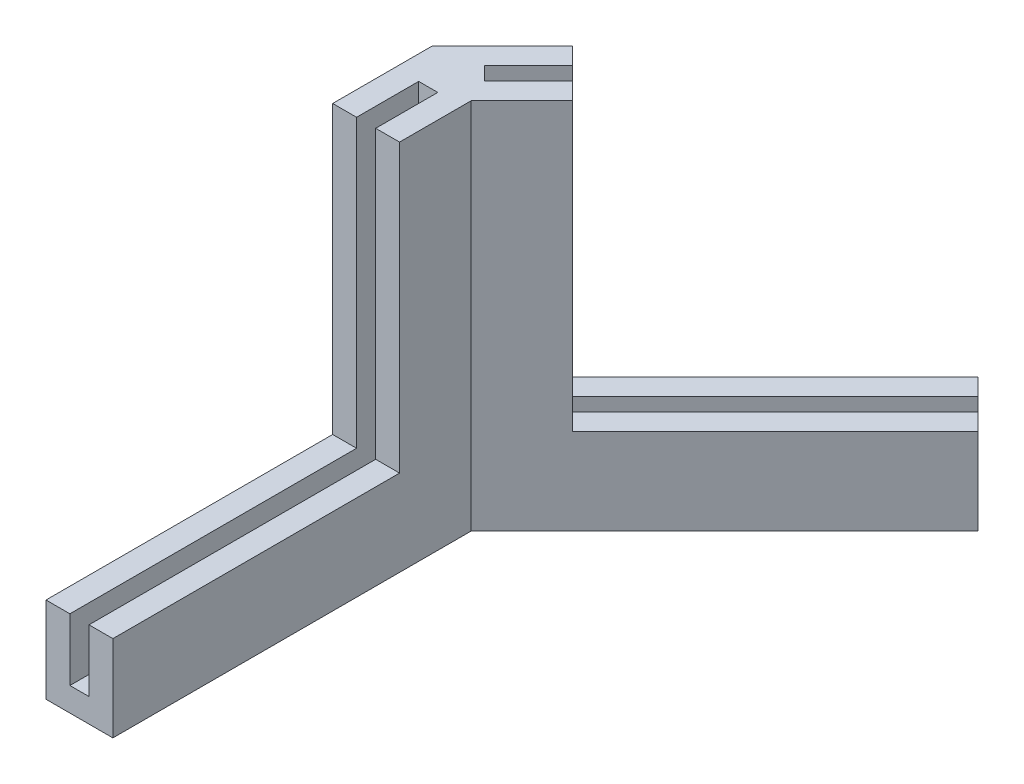
ISO-10303-21;
HEADER;
FILE_DESCRIPTION(('STEP AP214'),'2;1');
FILE_NAME('part.step','',(''),(''),'','','');
FILE_SCHEMA(('AUTOMOTIVE_DESIGN { 1 0 10303 214 1 1 1 1 }'));
ENDSEC;
DATA;
#1=APPLICATION_CONTEXT('core data for automotive mechanical design processes');
#2=APPLICATION_PROTOCOL_DEFINITION('international standard','automotive_design',2000,#1);
#3=PRODUCT_CONTEXT('',#1,'mechanical');
#4=PRODUCT('Part','Part','',(#3));
#5=PRODUCT_RELATED_PRODUCT_CATEGORY('part','',(#4));
#6=PRODUCT_DEFINITION_FORMATION('','',#4);
#7=PRODUCT_DEFINITION_CONTEXT('part definition',#1,'design');
#8=PRODUCT_DEFINITION('design','',#6,#7);
#9=PRODUCT_DEFINITION_SHAPE('','',#8);
#10=(LENGTH_UNIT() NAMED_UNIT(*) SI_UNIT(.MILLI.,.METRE.));
#11=(NAMED_UNIT(*) PLANE_ANGLE_UNIT() SI_UNIT($,.RADIAN.));
#12=(NAMED_UNIT(*) SI_UNIT($,.STERADIAN.) SOLID_ANGLE_UNIT());
#13=UNCERTAINTY_MEASURE_WITH_UNIT(LENGTH_MEASURE(1.E-05),#10,'distance_accuracy_value','');
#14=(GEOMETRIC_REPRESENTATION_CONTEXT(3) GLOBAL_UNCERTAINTY_ASSIGNED_CONTEXT((#13)) GLOBAL_UNIT_ASSIGNED_CONTEXT((#10,
#11,#12)) REPRESENTATION_CONTEXT('',''));
#15=CARTESIAN_POINT('',(0.,0.,0.));
#16=DIRECTION('',(0.,0.,1.));
#17=DIRECTION('',(1.,0.,0.));
#18=AXIS2_PLACEMENT_3D('',#15,#16,#17);
#19=CARTESIAN_POINT('',(10.6066017177981,78.,-10.6066017177983));
#20=DIRECTION('',(0.707106781186539,0.,-0.707106781186556));
#21=DIRECTION('',(-0.707106781186556,0.,-0.707106781186539));
#22=AXIS2_PLACEMENT_3D('',#19,#20,#21);
#23=PLANE('',#22);
#24=DIRECTION('',(0.,-1.,0.));
#25=VECTOR('',#24,1.);
#26=CARTESIAN_POINT('',(10.6066017177981,78.,-10.6066017177983));
#27=LINE('',#26,#25);
#28=CARTESIAN_POINT('',(10.6066017177981,78.,-10.6066017177983));
#29=VERTEX_POINT('',#28);
#30=CARTESIAN_POINT('',(10.6066017177981,18.,-10.6066017177983));
#31=VERTEX_POINT('',#30);
#32=EDGE_CURVE('E375',#29,#31,#27,.T.);
#33=ORIENTED_EDGE('',*,*,#32,.T.);
#34=DIRECTION('',(-0.707106781186556,0.,-0.707106781186539));
#35=VECTOR('',#34,1.);
#36=CARTESIAN_POINT('',(10.6066017177981,18.,-10.6066017177983));
#37=LINE('',#36,#35);
#38=CARTESIAN_POINT('',(7.07106781186529,18.,-14.142135623731));
#39=VERTEX_POINT('',#38);
#40=EDGE_CURVE('E211',#31,#39,#37,.T.);
#41=ORIENTED_EDGE('',*,*,#40,.T.);
#42=DIRECTION('',(0.,-1.,0.));
#43=VECTOR('',#42,1.);
#44=CARTESIAN_POINT('',(7.07106781186529,78.,-14.142135623731));
#45=LINE('',#44,#43);
#46=CARTESIAN_POINT('',(7.07106781186529,78.,-14.142135623731));
#47=VERTEX_POINT('',#46);
#48=EDGE_CURVE('E371',#47,#39,#45,.T.);
#49=ORIENTED_EDGE('',*,*,#48,.F.);
#50=DIRECTION('',(0.707106781186556,0.,0.707106781186539));
#51=VECTOR('',#50,1.);
#52=CARTESIAN_POINT('',(10.6066017177981,78.,-10.6066017177983));
#53=LINE('',#52,#51);
#54=EDGE_CURVE('E328',#47,#29,#53,.T.);
#55=ORIENTED_EDGE('',*,*,#54,.T.);
#56=EDGE_LOOP('',(#33,#41,#49,#55));
#57=FACE_BOUND('',#56,.T.);
#58=ADVANCED_FACE('F39',(#57),#23,.T.);
#59=DIRECTION('',(0.,-1.,0.));
#60=VECTOR('',#59,1.);
#61=CARTESIAN_POINT('',(4.24264068711906,78.,-16.9705627484772));
#62=LINE('',#61,#60);
#63=CARTESIAN_POINT('',(4.24264068711906,78.,-16.9705627484772));
#64=VERTEX_POINT('',#63);
#65=CARTESIAN_POINT('',(4.24264068711907,18.,-16.9705627484772));
#66=VERTEX_POINT('',#65);
#67=EDGE_CURVE('E359',#64,#66,#62,.T.);
#68=ORIENTED_EDGE('',*,*,#67,.T.);
#69=DIRECTION('',(-0.707106781186556,0.,-0.707106781186539));
#70=VECTOR('',#69,1.);
#71=CARTESIAN_POINT('',(0.707106781186285,18.,-20.5060966544099));
#72=LINE('',#71,#70);
#73=CARTESIAN_POINT('',(0.707106781186281,18.,-20.5060966544099));
#74=VERTEX_POINT('',#73);
#75=EDGE_CURVE('E239',#66,#74,#72,.T.);
#76=ORIENTED_EDGE('',*,*,#75,.T.);
#77=DIRECTION('',(0.,-1.,0.));
#78=VECTOR('',#77,1.);
#79=CARTESIAN_POINT('',(0.707106781186281,78.,-20.5060966544099));
#80=LINE('',#79,#78);
#81=CARTESIAN_POINT('',(0.707106781186281,78.,-20.5060966544099));
#82=VERTEX_POINT('',#81);
#83=EDGE_CURVE('E196',#82,#74,#80,.T.);
#84=ORIENTED_EDGE('',*,*,#83,.F.);
#85=DIRECTION('',(0.707106781186556,0.,0.707106781186539));
#86=VECTOR('',#85,1.);
#87=CARTESIAN_POINT('',(4.24264068711906,78.,-16.9705627484772));
#88=LINE('',#87,#86);
#89=EDGE_CURVE('E345',#82,#64,#88,.T.);
#90=ORIENTED_EDGE('',*,*,#89,.T.);
#91=EDGE_LOOP('',(#68,#76,#84,#90));
#92=FACE_BOUND('',#91,.T.);
#93=ADVANCED_FACE('F473',(#92),#23,.T.);
#94=CARTESIAN_POINT('',(0.,78.,15.));
#95=DIRECTION('',(0.,0.,-1.));
#96=DIRECTION('',(-1.,0.,0.));
#97=AXIS2_PLACEMENT_3D('',#94,#95,#96);
#98=PLANE('',#97);
#99=DIRECTION('',(-1.,0.,0.));
#100=VECTOR('',#99,1.);
#101=CARTESIAN_POINT('',(-14.,18.,15.));
#102=LINE('',#101,#100);
#103=CARTESIAN_POINT('',(-9.,18.,15.));
#104=VERTEX_POINT('',#103);
#105=CARTESIAN_POINT('',(-14.,18.,15.));
#106=VERTEX_POINT('',#105);
#107=EDGE_CURVE('E257',#104,#106,#102,.T.);
#108=ORIENTED_EDGE('',*,*,#107,.F.);
#109=DIRECTION('',(0.,-1.,0.));
#110=VECTOR('',#109,1.);
#111=CARTESIAN_POINT('',(-9.,78.,15.));
#112=LINE('',#111,#110);
#113=CARTESIAN_POINT('',(-9.,78.,15.));
#114=VERTEX_POINT('',#113);
#115=EDGE_CURVE('E425',#114,#104,#112,.T.);
#116=ORIENTED_EDGE('',*,*,#115,.F.);
#117=DIRECTION('',(1.,0.,0.));
#118=VECTOR('',#117,1.);
#119=CARTESIAN_POINT('',(-9.,78.,15.));
#120=LINE('',#119,#118);
#121=CARTESIAN_POINT('',(-14.,78.,15.));
#122=VERTEX_POINT('',#121);
#123=EDGE_CURVE('E383',#122,#114,#120,.T.);
#124=ORIENTED_EDGE('',*,*,#123,.F.);
#125=DIRECTION('',(0.,-1.,0.));
#126=VECTOR('',#125,1.);
#127=CARTESIAN_POINT('',(-14.,78.,15.));
#128=LINE('',#127,#126);
#129=EDGE_CURVE('E48',#122,#106,#128,.T.);
#130=ORIENTED_EDGE('',*,*,#129,.T.);
#131=EDGE_LOOP('',(#108,#116,#124,#130));
#132=FACE_BOUND('',#131,.T.);
#133=ADVANCED_FACE('F471',(#132),#98,.F.);
#134=DIRECTION('',(-1.,0.,0.));
#135=VECTOR('',#134,1.);
#136=CARTESIAN_POINT('',(0.,18.,15.));
#137=LINE('',#136,#135);
#138=CARTESIAN_POINT('',(0.,18.,15.));
#139=VERTEX_POINT('',#138);
#140=CARTESIAN_POINT('',(-5.,18.,15.));
#141=VERTEX_POINT('',#140);
#142=EDGE_CURVE('E198',#139,#141,#137,.T.);
#143=ORIENTED_EDGE('',*,*,#142,.F.);
#144=DIRECTION('',(0.,-1.,0.));
#145=VECTOR('',#144,1.);
#146=CARTESIAN_POINT('',(0.,78.,15.));
#147=LINE('',#146,#145);
#148=CARTESIAN_POINT('',(0.,78.,15.));
#149=VERTEX_POINT('',#148);
#150=EDGE_CURVE('E410',#149,#139,#147,.T.);
#151=ORIENTED_EDGE('',*,*,#150,.F.);
#152=DIRECTION('',(1.,0.,0.));
#153=VECTOR('',#152,1.);
#154=CARTESIAN_POINT('',(0.,78.,15.));
#155=LINE('',#154,#153);
#156=CARTESIAN_POINT('',(-5.,78.,15.));
#157=VERTEX_POINT('',#156);
#158=EDGE_CURVE('E396',#157,#149,#155,.T.);
#159=ORIENTED_EDGE('',*,*,#158,.F.);
#160=DIRECTION('',(0.,-1.,0.));
#161=VECTOR('',#160,1.);
#162=CARTESIAN_POINT('',(-5.,78.,15.));
#163=LINE('',#162,#161);
#164=EDGE_CURVE('E414',#157,#141,#163,.T.);
#165=ORIENTED_EDGE('',*,*,#164,.T.);
#166=EDGE_LOOP('',(#143,#151,#159,#165));
#167=FACE_BOUND('',#166,.T.);
#168=ADVANCED_FACE('F464',(#167),#98,.F.);
#169=CARTESIAN_POINT('',(-9.00000000000004,78.,1.99999999999999));
#170=DIRECTION('',(-1.,0.,0.));
#171=DIRECTION('',(0.,0.,1.));
#172=AXIS2_PLACEMENT_3D('',#169,#170,#171);
#173=PLANE('',#172);
#174=DIRECTION('',(0.,0.,-1.));
#175=VECTOR('',#174,1.);
#176=CARTESIAN_POINT('',(-9.00000000000004,5.,15.));
#177=LINE('',#176,#175);
#178=CARTESIAN_POINT('',(-9.,5.,75.));
#179=VERTEX_POINT('',#178);
#180=CARTESIAN_POINT('',(-9.00000000000004,4.99999999999999,1.99999999999999));
#181=VERTEX_POINT('',#180);
#182=EDGE_CURVE('E306',#179,#181,#177,.T.);
#183=ORIENTED_EDGE('',*,*,#182,.T.);
#184=DIRECTION('',(0.,-1.,0.));
#185=VECTOR('',#184,1.);
#186=CARTESIAN_POINT('',(-9.00000000000004,78.,1.99999999999999));
#187=LINE('',#186,#185);
#188=CARTESIAN_POINT('',(-9.00000000000004,78.,1.99999999999999));
#189=VERTEX_POINT('',#188);
#190=EDGE_CURVE('E421',#189,#181,#187,.T.);
#191=ORIENTED_EDGE('',*,*,#190,.F.);
#192=DIRECTION('',(0.,0.,-1.));
#193=VECTOR('',#192,1.);
#194=CARTESIAN_POINT('',(-9.00000000000004,78.,1.99999999999999));
#195=LINE('',#194,#193);
#196=EDGE_CURVE('E387',#114,#189,#195,.T.);
#197=ORIENTED_EDGE('',*,*,#196,.F.);
#198=ORIENTED_EDGE('',*,*,#115,.T.);
#199=DIRECTION('',(0.,0.,-1.));
#200=VECTOR('',#199,1.);
#201=CARTESIAN_POINT('',(-9.,18.,75.));
#202=LINE('',#201,#200);
#203=CARTESIAN_POINT('',(-9.,18.,75.));
#204=VERTEX_POINT('',#203);
#205=EDGE_CURVE('E290',#204,#104,#202,.T.);
#206=ORIENTED_EDGE('',*,*,#205,.F.);
#207=DIRECTION('',(0.,1.,0.));
#208=VECTOR('',#207,1.);
#209=CARTESIAN_POINT('',(-9.,5.,75.));
#210=LINE('',#209,#208);
#211=EDGE_CURVE('E275',#179,#204,#210,.T.);
#212=ORIENTED_EDGE('',*,*,#211,.F.);
#213=EDGE_LOOP('',(#183,#191,#197,#198,#206,#212));
#214=FACE_BOUND('',#213,.T.);
#215=ADVANCED_FACE('F433',(#214),#173,.F.);
#216=CARTESIAN_POINT('',(-5.00000000000004,78.,1.99999999999999));
#217=DIRECTION('',(0.,0.,-1.));
#218=DIRECTION('',(-1.,0.,0.));
#219=AXIS2_PLACEMENT_3D('',#216,#217,#218);
#220=PLANE('',#219);
#221=DIRECTION('',(-1.,0.,0.));
#222=VECTOR('',#221,1.);
#223=CARTESIAN_POINT('',(-5.00000000000004,5.,1.99999999999999));
#224=LINE('',#223,#222);
#225=CARTESIAN_POINT('',(-5.00000000000004,4.99999999999999,1.99999999999999));
#226=VERTEX_POINT('',#225);
#227=EDGE_CURVE('E302',#226,#181,#224,.T.);
#228=ORIENTED_EDGE('',*,*,#227,.F.);
#229=DIRECTION('',(0.,-1.,0.));
#230=VECTOR('',#229,1.);
#231=CARTESIAN_POINT('',(-5.00000000000004,78.,1.99999999999999));
#232=LINE('',#231,#230);
#233=CARTESIAN_POINT('',(-5.00000000000004,78.,1.99999999999999));
#234=VERTEX_POINT('',#233);
#235=EDGE_CURVE('E417',#234,#226,#232,.T.);
#236=ORIENTED_EDGE('',*,*,#235,.F.);
#237=DIRECTION('',(1.,0.,0.));
#238=VECTOR('',#237,1.);
#239=CARTESIAN_POINT('',(-5.00000000000004,78.,1.99999999999999));
#240=LINE('',#239,#238);
#241=EDGE_CURVE('E390',#189,#234,#240,.T.);
#242=ORIENTED_EDGE('',*,*,#241,.F.);
#243=ORIENTED_EDGE('',*,*,#190,.T.);
#244=EDGE_LOOP('',(#228,#236,#242,#243));
#245=FACE_BOUND('',#244,.T.);
#246=ADVANCED_FACE('F447',(#245),#220,.F.);
#247=CARTESIAN_POINT('',(-5.,78.,15.));
#248=DIRECTION('',(1.,0.,0.));
#249=DIRECTION('',(0.,0.,-1.));
#250=AXIS2_PLACEMENT_3D('',#247,#248,#249);
#251=PLANE('',#250);
#252=DIRECTION('',(0.,0.,-1.));
#253=VECTOR('',#252,1.);
#254=CARTESIAN_POINT('',(-5.00000000000004,5.,15.));
#255=LINE('',#254,#253);
#256=CARTESIAN_POINT('',(-5.,5.,75.));
#257=VERTEX_POINT('',#256);
#258=EDGE_CURVE('E309',#257,#226,#255,.T.);
#259=ORIENTED_EDGE('',*,*,#258,.F.);
#260=DIRECTION('',(0.,-1.,0.));
#261=VECTOR('',#260,1.);
#262=CARTESIAN_POINT('',(-5.,18.,75.));
#263=LINE('',#262,#261);
#264=CARTESIAN_POINT('',(-5.,18.,75.));
#265=VERTEX_POINT('',#264);
#266=EDGE_CURVE('E267',#265,#257,#263,.T.);
#267=ORIENTED_EDGE('',*,*,#266,.F.);
#268=DIRECTION('',(0.,0.,-1.));
#269=VECTOR('',#268,1.);
#270=CARTESIAN_POINT('',(-5.,18.,75.));
#271=LINE('',#270,#269);
#272=EDGE_CURVE('E294',#265,#141,#271,.T.);
#273=ORIENTED_EDGE('',*,*,#272,.T.);
#274=ORIENTED_EDGE('',*,*,#164,.F.);
#275=DIRECTION('',(0.,0.,1.));
#276=VECTOR('',#275,1.);
#277=CARTESIAN_POINT('',(-5.,78.,15.));
#278=LINE('',#277,#276);
#279=EDGE_CURVE('E393',#234,#157,#278,.T.);
#280=ORIENTED_EDGE('',*,*,#279,.F.);
#281=ORIENTED_EDGE('',*,*,#235,.T.);
#282=EDGE_LOOP('',(#259,#267,#273,#274,#280,#281));
#283=FACE_BOUND('',#282,.T.);
#284=ADVANCED_FACE('F452',(#283),#251,.F.);
#285=CARTESIAN_POINT('',(7.07106781186529,78.,-14.142135623731));
#286=DIRECTION('',(-0.707106781186554,0.,-0.707106781186541));
#287=DIRECTION('',(-0.707106781186541,0.,0.707106781186554));
#288=AXIS2_PLACEMENT_3D('',#285,#286,#287);
#289=PLANE('',#288);
#290=ORIENTED_EDGE('',*,*,#48,.T.);
#291=DIRECTION('',(-0.707106781186539,0.,0.707106781186556));
#292=VECTOR('',#291,1.);
#293=CARTESIAN_POINT('',(49.4974746830576,18.,-56.5685424949244));
#294=LINE('',#293,#292);
#295=CARTESIAN_POINT('',(49.4974746830576,18.,-56.5685424949244));
#296=VERTEX_POINT('',#295);
#297=EDGE_CURVE('E247',#296,#39,#294,.T.);
#298=ORIENTED_EDGE('',*,*,#297,.F.);
#299=DIRECTION('',(0.,-1.,0.));
#300=VECTOR('',#299,1.);
#301=CARTESIAN_POINT('',(49.4974746830576,18.,-56.5685424949244));
#302=LINE('',#301,#300);
#303=CARTESIAN_POINT('',(49.4974746830576,5.,-56.5685424949244));
#304=VERTEX_POINT('',#303);
#305=EDGE_CURVE('E224',#296,#304,#302,.T.);
#306=ORIENTED_EDGE('',*,*,#305,.T.);
#307=DIRECTION('',(-0.707106781186539,0.,0.707106781186556));
#308=VECTOR('',#307,1.);
#309=CARTESIAN_POINT('',(7.07106781186526,5.,-14.1421356237311));
#310=LINE('',#309,#308);
#311=CARTESIAN_POINT('',(-2.12132034355974,5.,-4.94974746830583));
#312=VERTEX_POINT('',#311);
#313=EDGE_CURVE('E316',#304,#312,#310,.T.);
#314=ORIENTED_EDGE('',*,*,#313,.T.);
#315=DIRECTION('',(0.,-1.,0.));
#316=VECTOR('',#315,1.);
#317=CARTESIAN_POINT('',(-2.12132034355975,78.,-4.94974746830583));
#318=LINE('',#317,#316);
#319=CARTESIAN_POINT('',(-2.12132034355975,78.,-4.94974746830583));
#320=VERTEX_POINT('',#319);
#321=EDGE_CURVE('E367',#320,#312,#318,.T.);
#322=ORIENTED_EDGE('',*,*,#321,.F.);
#323=DIRECTION('',(0.707106781186541,0.,-0.707106781186554));
#324=VECTOR('',#323,1.);
#325=CARTESIAN_POINT('',(7.07106781186529,78.,-14.142135623731));
#326=LINE('',#325,#324);
#327=EDGE_CURVE('E333',#320,#47,#326,.T.);
#328=ORIENTED_EDGE('',*,*,#327,.T.);
#329=EDGE_LOOP('',(#290,#298,#306,#314,#322,#328));
#330=FACE_BOUND('',#329,.T.);
#331=ADVANCED_FACE('F489',(#330),#289,.T.);
#332=CARTESIAN_POINT('',(-2.12132034355975,78.,-4.94974746830583));
#333=DIRECTION('',(0.707106781186539,0.,-0.707106781186556));
#334=DIRECTION('',(-0.707106781186556,0.,-0.707106781186539));
#335=AXIS2_PLACEMENT_3D('',#332,#333,#334);
#336=PLANE('',#335);
#337=ORIENTED_EDGE('',*,*,#321,.T.);
#338=DIRECTION('',(0.707106781186556,0.,0.707106781186539));
#339=VECTOR('',#338,1.);
#340=CARTESIAN_POINT('',(-4.94974746830597,5.,-7.77817459305198));
#341=LINE('',#340,#339);
#342=CARTESIAN_POINT('',(-4.94974746830597,5.,-7.77817459305198));
#343=VERTEX_POINT('',#342);
#344=EDGE_CURVE('E313',#343,#312,#341,.T.);
#345=ORIENTED_EDGE('',*,*,#344,.F.);
#346=DIRECTION('',(0.,-1.,0.));
#347=VECTOR('',#346,1.);
#348=CARTESIAN_POINT('',(-4.94974746830597,78.,-7.77817459305198));
#349=LINE('',#348,#347);
#350=CARTESIAN_POINT('',(-4.94974746830597,78.,-7.77817459305198));
#351=VERTEX_POINT('',#350);
#352=EDGE_CURVE('E363',#351,#343,#349,.T.);
#353=ORIENTED_EDGE('',*,*,#352,.F.);
#354=DIRECTION('',(0.707106781186556,0.,0.707106781186539));
#355=VECTOR('',#354,1.);
#356=CARTESIAN_POINT('',(-2.12132034355975,78.,-4.94974746830583));
#357=LINE('',#356,#355);
#358=EDGE_CURVE('E337',#351,#320,#357,.T.);
#359=ORIENTED_EDGE('',*,*,#358,.T.);
#360=EDGE_LOOP('',(#337,#345,#353,#359));
#361=FACE_BOUND('',#360,.T.);
#362=ADVANCED_FACE('F522',(#361),#336,.T.);
#363=CARTESIAN_POINT('',(-4.94974746830597,78.,-7.77817459305198));
#364=DIRECTION('',(0.707106781186554,0.,0.707106781186541));
#365=DIRECTION('',(0.707106781186541,0.,-0.707106781186554));
#366=AXIS2_PLACEMENT_3D('',#363,#364,#365);
#367=PLANE('',#366);
#368=ORIENTED_EDGE('',*,*,#352,.T.);
#369=DIRECTION('',(-0.707106781186539,0.,0.707106781186556));
#370=VECTOR('',#369,1.);
#371=CARTESIAN_POINT('',(4.24264068711904,5.,-16.9705627484772));
#372=LINE('',#371,#370);
#373=CARTESIAN_POINT('',(46.6690475583114,5.,-59.3969696196706));
#374=VERTEX_POINT('',#373);
#375=EDGE_CURVE('E320',#374,#343,#372,.T.);
#376=ORIENTED_EDGE('',*,*,#375,.F.);
#377=DIRECTION('',(0.,1.,0.));
#378=VECTOR('',#377,1.);
#379=CARTESIAN_POINT('',(46.6690475583114,5.,-59.3969696196706));
#380=LINE('',#379,#378);
#381=CARTESIAN_POINT('',(46.6690475583114,18.,-59.3969696196706));
#382=VERTEX_POINT('',#381);
#383=EDGE_CURVE('E215',#374,#382,#380,.T.);
#384=ORIENTED_EDGE('',*,*,#383,.T.);
#385=DIRECTION('',(-0.707106781186539,0.,0.707106781186556));
#386=VECTOR('',#385,1.);
#387=CARTESIAN_POINT('',(46.6690475583114,18.,-59.3969696196706));
#388=LINE('',#387,#386);
#389=EDGE_CURVE('E199',#382,#66,#388,.T.);
#390=ORIENTED_EDGE('',*,*,#389,.T.);
#391=ORIENTED_EDGE('',*,*,#67,.F.);
#392=DIRECTION('',(-0.707106781186541,0.,0.707106781186554));
#393=VECTOR('',#392,1.);
#394=CARTESIAN_POINT('',(-4.94974746830597,78.,-7.77817459305198));
#395=LINE('',#394,#393);
#396=EDGE_CURVE('E341',#64,#351,#395,.T.);
#397=ORIENTED_EDGE('',*,*,#396,.T.);
#398=EDGE_LOOP('',(#368,#376,#384,#390,#391,#397));
#399=FACE_BOUND('',#398,.T.);
#400=ADVANCED_FACE('F506',(#399),#367,.T.);
#401=CARTESIAN_POINT('',(-14.,78.,15.));
#402=DIRECTION('',(1.,0.,0.));
#403=DIRECTION('',(0.,0.,-1.));
#404=AXIS2_PLACEMENT_3D('',#401,#402,#403);
#405=PLANE('',#404);
#406=DIRECTION('',(0.,0.,1.));
#407=VECTOR('',#406,1.);
#408=CARTESIAN_POINT('',(-14.,0.,15.));
#409=LINE('',#408,#407);
#410=CARTESIAN_POINT('',(-14.,0.,-5.79898987322323));
#411=VERTEX_POINT('',#410);
#412=CARTESIAN_POINT('',(-14.,0.,75.));
#413=VERTEX_POINT('',#412);
#414=EDGE_CURVE('E379',#411,#413,#409,.T.);
#415=ORIENTED_EDGE('',*,*,#414,.T.);
#416=DIRECTION('',(0.,-1.,0.));
#417=VECTOR('',#416,1.);
#418=CARTESIAN_POINT('',(-14.,0.,75.));
#419=LINE('',#418,#417);
#420=CARTESIAN_POINT('',(-14.,18.,75.));
#421=VERTEX_POINT('',#420);
#422=EDGE_CURVE('E252',#421,#413,#419,.T.);
#423=ORIENTED_EDGE('',*,*,#422,.F.);
#424=DIRECTION('',(0.,0.,-1.));
#425=VECTOR('',#424,1.);
#426=CARTESIAN_POINT('',(-14.,18.,75.));
#427=LINE('',#426,#425);
#428=EDGE_CURVE('E281',#421,#106,#427,.T.);
#429=ORIENTED_EDGE('',*,*,#428,.T.);
#430=ORIENTED_EDGE('',*,*,#129,.F.);
#431=DIRECTION('',(0.,0.,1.));
#432=VECTOR('',#431,1.);
#433=CARTESIAN_POINT('',(-14.,78.,15.));
#434=LINE('',#433,#432);
#435=CARTESIAN_POINT('',(-14.,78.,-5.79898987322323));
#436=VERTEX_POINT('',#435);
#437=EDGE_CURVE('E380',#436,#122,#434,.T.);
#438=ORIENTED_EDGE('',*,*,#437,.F.);
#439=DIRECTION('',(0.,-1.,0.));
#440=VECTOR('',#439,1.);
#441=CARTESIAN_POINT('',(-14.,78.,-5.79898987322323));
#442=LINE('',#441,#440);
#443=EDGE_CURVE('E11',#436,#411,#442,.T.);
#444=ORIENTED_EDGE('',*,*,#443,.T.);
#445=EDGE_LOOP('',(#415,#423,#429,#430,#438,#444));
#446=FACE_BOUND('',#445,.T.);
#447=ADVANCED_FACE('F41',(#446),#405,.F.);
#448=CARTESIAN_POINT('',(0.,78.,0.));
#449=DIRECTION('',(-1.,0.,0.));
#450=DIRECTION('',(0.,0.,1.));
#451=AXIS2_PLACEMENT_3D('',#448,#449,#450);
#452=PLANE('',#451);
#453=DIRECTION('',(0.,0.,-1.));
#454=VECTOR('',#453,1.);
#455=CARTESIAN_POINT('',(0.,0.,0.));
#456=LINE('',#455,#454);
#457=CARTESIAN_POINT('',(0.,0.,75.));
#458=VERTEX_POINT('',#457);
#459=CARTESIAN_POINT('',(0.,0.,0.));
#460=VERTEX_POINT('',#459);
#461=EDGE_CURVE('E384',#458,#460,#456,.T.);
#462=ORIENTED_EDGE('',*,*,#461,.T.);
#463=DIRECTION('',(0.,-1.,0.));
#464=VECTOR('',#463,1.);
#465=CARTESIAN_POINT('',(0.,78.,0.));
#466=LINE('',#465,#464);
#467=CARTESIAN_POINT('',(0.,78.,0.));
#468=VERTEX_POINT('',#467);
#469=EDGE_CURVE('E402',#468,#460,#466,.T.);
#470=ORIENTED_EDGE('',*,*,#469,.F.);
#471=DIRECTION('',(0.,0.,-1.));
#472=VECTOR('',#471,1.);
#473=CARTESIAN_POINT('',(0.,78.,0.));
#474=LINE('',#473,#472);
#475=EDGE_CURVE('E399',#149,#468,#474,.T.);
#476=ORIENTED_EDGE('',*,*,#475,.F.);
#477=ORIENTED_EDGE('',*,*,#150,.T.);
#478=DIRECTION('',(0.,0.,-1.));
#479=VECTOR('',#478,1.);
#480=CARTESIAN_POINT('',(0.,18.,75.));
#481=LINE('',#480,#479);
#482=CARTESIAN_POINT('',(0.,18.,75.));
#483=VERTEX_POINT('',#482);
#484=EDGE_CURVE('E298',#483,#139,#481,.T.);
#485=ORIENTED_EDGE('',*,*,#484,.F.);
#486=DIRECTION('',(0.,1.,0.));
#487=VECTOR('',#486,1.);
#488=CARTESIAN_POINT('',(0.,0.,75.));
#489=LINE('',#488,#487);
#490=EDGE_CURVE('E261',#458,#483,#489,.T.);
#491=ORIENTED_EDGE('',*,*,#490,.F.);
#492=EDGE_LOOP('',(#462,#470,#476,#477,#485,#491));
#493=FACE_BOUND('',#492,.T.);
#494=ADVANCED_FACE('F498',(#493),#452,.F.);
#495=CARTESIAN_POINT('',(0.,78.,0.));
#496=DIRECTION('',(0.,-1.,0.));
#497=DIRECTION('',(0.,0.,-1.));
#498=AXIS2_PLACEMENT_3D('',#495,#496,#497);
#499=PLANE('',#498);
#500=ORIENTED_EDGE('',*,*,#475,.T.);
#501=DIRECTION('',(-0.707106781186539,0.,0.707106781186556));
#502=VECTOR('',#501,1.);
#503=CARTESIAN_POINT('',(0.,78.,0.));
#504=LINE('',#503,#502);
#505=EDGE_CURVE('E324',#29,#468,#504,.T.);
#506=ORIENTED_EDGE('',*,*,#505,.F.);
#507=ORIENTED_EDGE('',*,*,#54,.F.);
#508=ORIENTED_EDGE('',*,*,#327,.F.);
#509=ORIENTED_EDGE('',*,*,#358,.F.);
#510=ORIENTED_EDGE('',*,*,#396,.F.);
#511=ORIENTED_EDGE('',*,*,#89,.F.);
#512=DIRECTION('',(0.707106781186539,0.,-0.707106781186556));
#513=VECTOR('',#512,1.);
#514=CARTESIAN_POINT('',(0.707106781186281,78.,-20.5060966544099));
#515=LINE('',#514,#513);
#516=EDGE_CURVE('E349',#436,#82,#515,.T.);
#517=ORIENTED_EDGE('',*,*,#516,.F.);
#518=ORIENTED_EDGE('',*,*,#437,.T.);
#519=ORIENTED_EDGE('',*,*,#123,.T.);
#520=ORIENTED_EDGE('',*,*,#196,.T.);
#521=ORIENTED_EDGE('',*,*,#241,.T.);
#522=ORIENTED_EDGE('',*,*,#279,.T.);
#523=ORIENTED_EDGE('',*,*,#158,.T.);
#524=EDGE_LOOP('',(#500,#506,#507,#508,#509,#510,#511,#517,#518,#519,#520,#521,#522,#523));
#525=FACE_BOUND('',#524,.T.);
#526=ADVANCED_FACE('F467',(#525),#499,.F.);
#527=CARTESIAN_POINT('',(0.,0.,0.));
#528=DIRECTION('',(0.,-1.,0.));
#529=DIRECTION('',(0.,0.,-1.));
#530=AXIS2_PLACEMENT_3D('',#527,#528,#529);
#531=PLANE('',#530);
#532=DIRECTION('',(0.707106781186539,0.,-0.707106781186556));
#533=VECTOR('',#532,1.);
#534=CARTESIAN_POINT('',(0.707106781186281,0.,-20.5060966544099));
#535=LINE('',#534,#533);
#536=CARTESIAN_POINT('',(43.1335136523786,0.,-62.9325035256033));
#537=VERTEX_POINT('',#536);
#538=EDGE_CURVE('E329',#411,#537,#535,.T.);
#539=ORIENTED_EDGE('',*,*,#538,.T.);
#540=DIRECTION('',(0.707106781186556,0.,0.707106781186539));
#541=VECTOR('',#540,1.);
#542=CARTESIAN_POINT('',(43.1335136523786,0.,-62.9325035256033));
#543=LINE('',#542,#541);
#544=CARTESIAN_POINT('',(53.0330085889904,0.,-53.0330085889917));
#545=VERTEX_POINT('',#544);
#546=EDGE_CURVE('E209',#537,#545,#543,.T.);
#547=ORIENTED_EDGE('',*,*,#546,.T.);
#548=DIRECTION('',(-0.707106781186539,0.,0.707106781186556));
#549=VECTOR('',#548,1.);
#550=CARTESIAN_POINT('',(0.,0.,0.));
#551=LINE('',#550,#549);
#552=EDGE_CURVE('E323',#545,#460,#551,.T.);
#553=ORIENTED_EDGE('',*,*,#552,.T.);
#554=ORIENTED_EDGE('',*,*,#461,.F.);
#555=DIRECTION('',(1.,0.,0.));
#556=VECTOR('',#555,1.);
#557=CARTESIAN_POINT('',(-14.,0.,75.));
#558=LINE('',#557,#556);
#559=EDGE_CURVE('E256',#413,#458,#558,.T.);
#560=ORIENTED_EDGE('',*,*,#559,.F.);
#561=ORIENTED_EDGE('',*,*,#414,.F.);
#562=EDGE_LOOP('',(#539,#547,#553,#554,#560,#561));
#563=FACE_BOUND('',#562,.T.);
#564=ADVANCED_FACE('F494',(#563),#531,.T.);
#565=CARTESIAN_POINT('',(0.,78.,0.));
#566=DIRECTION('',(0.707106781186556,0.,0.707106781186539));
#567=DIRECTION('',(0.707106781186539,0.,-0.707106781186556));
#568=AXIS2_PLACEMENT_3D('',#565,#566,#567);
#569=PLANE('',#568);
#570=ORIENTED_EDGE('',*,*,#552,.F.);
#571=DIRECTION('',(0.,1.,0.));
#572=VECTOR('',#571,1.);
#573=CARTESIAN_POINT('',(53.0330085889904,0.,-53.0330085889917));
#574=LINE('',#573,#572);
#575=CARTESIAN_POINT('',(53.0330085889904,18.,-53.0330085889917));
#576=VERTEX_POINT('',#575);
#577=EDGE_CURVE('E232',#545,#576,#574,.T.);
#578=ORIENTED_EDGE('',*,*,#577,.T.);
#579=DIRECTION('',(-0.707106781186539,0.,0.707106781186556));
#580=VECTOR('',#579,1.);
#581=CARTESIAN_POINT('',(53.0330085889904,18.,-53.0330085889917));
#582=LINE('',#581,#580);
#583=EDGE_CURVE('E238',#576,#31,#582,.T.);
#584=ORIENTED_EDGE('',*,*,#583,.T.);
#585=ORIENTED_EDGE('',*,*,#32,.F.);
#586=ORIENTED_EDGE('',*,*,#505,.T.);
#587=ORIENTED_EDGE('',*,*,#469,.T.);
#588=EDGE_LOOP('',(#570,#578,#584,#585,#586,#587));
#589=FACE_BOUND('',#588,.T.);
#590=ADVANCED_FACE('F491',(#589),#569,.T.);
#591=CARTESIAN_POINT('',(0.707106781186281,78.,-20.5060966544099));
#592=DIRECTION('',(-0.707106781186557,0.,-0.707106781186539));
#593=DIRECTION('',(-0.707106781186539,0.,0.707106781186557));
#594=AXIS2_PLACEMENT_3D('',#591,#592,#593);
#595=PLANE('',#594);
#596=ORIENTED_EDGE('',*,*,#538,.F.);
#597=ORIENTED_EDGE('',*,*,#443,.F.);
#598=ORIENTED_EDGE('',*,*,#516,.T.);
#599=ORIENTED_EDGE('',*,*,#83,.T.);
#600=DIRECTION('',(-0.707106781186539,0.,0.707106781186556));
#601=VECTOR('',#600,1.);
#602=CARTESIAN_POINT('',(43.1335136523786,18.,-62.9325035256033));
#603=LINE('',#602,#601);
#604=CARTESIAN_POINT('',(43.1335136523786,18.,-62.9325035256033));
#605=VERTEX_POINT('',#604);
#606=EDGE_CURVE('E55',#605,#74,#603,.T.);
#607=ORIENTED_EDGE('',*,*,#606,.F.);
#608=DIRECTION('',(0.,-1.,0.));
#609=VECTOR('',#608,1.);
#610=CARTESIAN_POINT('',(43.1335136523786,0.,-62.9325035256033));
#611=LINE('',#610,#609);
#612=EDGE_CURVE('E193',#605,#537,#611,.T.);
#613=ORIENTED_EDGE('',*,*,#612,.T.);
#614=EDGE_LOOP('',(#596,#597,#598,#599,#607,#613));
#615=FACE_BOUND('',#614,.T.);
#616=ADVANCED_FACE('F192',(#615),#595,.T.);
#617=CARTESIAN_POINT('',(4.24264068711904,5.,-16.9705627484772));
#618=DIRECTION('',(0.,-1.,0.));
#619=DIRECTION('',(1.,0.,0.));
#620=AXIS2_PLACEMENT_3D('',#617,#618,#619);
#621=PLANE('',#620);
#622=ORIENTED_EDGE('',*,*,#344,.T.);
#623=ORIENTED_EDGE('',*,*,#313,.F.);
#624=DIRECTION('',(-0.707106781186556,0.,-0.707106781186539));
#625=VECTOR('',#624,1.);
#626=CARTESIAN_POINT('',(49.4974746830576,5.,-56.5685424949244));
#627=LINE('',#626,#625);
#628=EDGE_CURVE('E218',#304,#374,#627,.T.);
#629=ORIENTED_EDGE('',*,*,#628,.T.);
#630=ORIENTED_EDGE('',*,*,#375,.T.);
#631=EDGE_LOOP('',(#622,#623,#629,#630));
#632=FACE_BOUND('',#631,.T.);
#633=ADVANCED_FACE('F517',(#632),#621,.F.);
#634=CARTESIAN_POINT('',(-5.00000000000004,5.,15.));
#635=DIRECTION('',(0.,-1.,0.));
#636=DIRECTION('',(0.,0.,-1.));
#637=AXIS2_PLACEMENT_3D('',#634,#635,#636);
#638=PLANE('',#637);
#639=ORIENTED_EDGE('',*,*,#227,.T.);
#640=ORIENTED_EDGE('',*,*,#182,.F.);
#641=DIRECTION('',(-1.,0.,0.));
#642=VECTOR('',#641,1.);
#643=CARTESIAN_POINT('',(-5.,5.,75.));
#644=LINE('',#643,#642);
#645=EDGE_CURVE('E271',#257,#179,#644,.T.);
#646=ORIENTED_EDGE('',*,*,#645,.F.);
#647=ORIENTED_EDGE('',*,*,#258,.T.);
#648=EDGE_LOOP('',(#639,#640,#646,#647));
#649=FACE_BOUND('',#648,.T.);
#650=ADVANCED_FACE('F449',(#649),#638,.F.);
#651=CARTESIAN_POINT('',(0.,18.,75.));
#652=DIRECTION('',(0.,-1.,0.));
#653=DIRECTION('',(0.,0.,-1.));
#654=AXIS2_PLACEMENT_3D('',#651,#652,#653);
#655=PLANE('',#654);
#656=ORIENTED_EDGE('',*,*,#142,.T.);
#657=ORIENTED_EDGE('',*,*,#272,.F.);
#658=DIRECTION('',(-1.,0.,0.));
#659=VECTOR('',#658,1.);
#660=CARTESIAN_POINT('',(0.,18.,75.));
#661=LINE('',#660,#659);
#662=EDGE_CURVE('E264',#483,#265,#661,.T.);
#663=ORIENTED_EDGE('',*,*,#662,.F.);
#664=ORIENTED_EDGE('',*,*,#484,.T.);
#665=EDGE_LOOP('',(#656,#657,#663,#664));
#666=FACE_BOUND('',#665,.T.);
#667=ADVANCED_FACE('F459',(#666),#655,.F.);
#668=CARTESIAN_POINT('',(-14.,18.,75.));
#669=DIRECTION('',(0.,-1.,0.));
#670=DIRECTION('',(0.,0.,-1.));
#671=AXIS2_PLACEMENT_3D('',#668,#669,#670);
#672=PLANE('',#671);
#673=ORIENTED_EDGE('',*,*,#107,.T.);
#674=ORIENTED_EDGE('',*,*,#428,.F.);
#675=DIRECTION('',(-1.,0.,0.));
#676=VECTOR('',#675,1.);
#677=CARTESIAN_POINT('',(-14.,18.,75.));
#678=LINE('',#677,#676);
#679=EDGE_CURVE('E278',#204,#421,#678,.T.);
#680=ORIENTED_EDGE('',*,*,#679,.F.);
#681=ORIENTED_EDGE('',*,*,#205,.T.);
#682=EDGE_LOOP('',(#673,#674,#680,#681));
#683=FACE_BOUND('',#682,.T.);
#684=ADVANCED_FACE('F438',(#683),#672,.F.);
#685=CARTESIAN_POINT('',(0.,0.,75.));
#686=DIRECTION('',(0.,0.,-1.));
#687=DIRECTION('',(-1.,0.,0.));
#688=AXIS2_PLACEMENT_3D('',#685,#686,#687);
#689=PLANE('',#688);
#690=ORIENTED_EDGE('',*,*,#422,.T.);
#691=ORIENTED_EDGE('',*,*,#559,.T.);
#692=ORIENTED_EDGE('',*,*,#490,.T.);
#693=ORIENTED_EDGE('',*,*,#662,.T.);
#694=ORIENTED_EDGE('',*,*,#266,.T.);
#695=ORIENTED_EDGE('',*,*,#645,.T.);
#696=ORIENTED_EDGE('',*,*,#211,.T.);
#697=ORIENTED_EDGE('',*,*,#679,.T.);
#698=EDGE_LOOP('',(#690,#691,#692,#693,#694,#695,#696,#697));
#699=FACE_BOUND('',#698,.T.);
#700=ADVANCED_FACE('F442',(#699),#689,.F.);
#701=CARTESIAN_POINT('',(43.1335136523786,18.,-62.9325035256033));
#702=DIRECTION('',(0.,1.,0.));
#703=DIRECTION('',(0.,0.,1.));
#704=AXIS2_PLACEMENT_3D('',#701,#702,#703);
#705=PLANE('',#704);
#706=ORIENTED_EDGE('',*,*,#75,.F.);
#707=ORIENTED_EDGE('',*,*,#389,.F.);
#708=DIRECTION('',(-0.707106781186556,0.,-0.707106781186539));
#709=VECTOR('',#708,1.);
#710=CARTESIAN_POINT('',(43.1335136523786,18.,-62.9325035256033));
#711=LINE('',#710,#709);
#712=EDGE_CURVE('E205',#382,#605,#711,.T.);
#713=ORIENTED_EDGE('',*,*,#712,.T.);
#714=ORIENTED_EDGE('',*,*,#606,.T.);
#715=EDGE_LOOP('',(#706,#707,#713,#714));
#716=FACE_BOUND('',#715,.T.);
#717=ADVANCED_FACE('F213',(#716),#705,.T.);
#718=CARTESIAN_POINT('',(53.0330085889904,18.,-53.0330085889917));
#719=DIRECTION('',(0.,1.,0.));
#720=DIRECTION('',(0.,0.,1.));
#721=AXIS2_PLACEMENT_3D('',#718,#719,#720);
#722=PLANE('',#721);
#723=ORIENTED_EDGE('',*,*,#40,.F.);
#724=ORIENTED_EDGE('',*,*,#583,.F.);
#725=DIRECTION('',(-0.707106781186556,0.,-0.707106781186539));
#726=VECTOR('',#725,1.);
#727=CARTESIAN_POINT('',(53.0330085889904,18.,-53.0330085889917));
#728=LINE('',#727,#726);
#729=EDGE_CURVE('E228',#576,#296,#728,.T.);
#730=ORIENTED_EDGE('',*,*,#729,.T.);
#731=ORIENTED_EDGE('',*,*,#297,.T.);
#732=EDGE_LOOP('',(#723,#724,#730,#731));
#733=FACE_BOUND('',#732,.T.);
#734=ADVANCED_FACE('F526',(#733),#722,.T.);
#735=CARTESIAN_POINT('',(53.0330085889904,0.,-53.0330085889917));
#736=DIRECTION('',(-0.707106781186539,0.,0.707106781186556));
#737=DIRECTION('',(-0.707106781186556,0.,-0.707106781186539));
#738=AXIS2_PLACEMENT_3D('',#735,#736,#737);
#739=PLANE('',#738);
#740=ORIENTED_EDGE('',*,*,#612,.F.);
#741=ORIENTED_EDGE('',*,*,#712,.F.);
#742=ORIENTED_EDGE('',*,*,#383,.F.);
#743=ORIENTED_EDGE('',*,*,#628,.F.);
#744=ORIENTED_EDGE('',*,*,#305,.F.);
#745=ORIENTED_EDGE('',*,*,#729,.F.);
#746=ORIENTED_EDGE('',*,*,#577,.F.);
#747=ORIENTED_EDGE('',*,*,#546,.F.);
#748=EDGE_LOOP('',(#740,#741,#742,#743,#744,#745,#746,#747));
#749=FACE_BOUND('',#748,.T.);
#750=ADVANCED_FACE('F203',(#749),#739,.F.);
#751=CLOSED_SHELL('',(#58,#93,#133,#168,#215,#246,#284,#331,#362,#400,#447,#494,#526,#564,#590,
#616,#633,#650,#667,#684,#700,#717,#734,#750));
#752=MANIFOLD_SOLID_BREP('B2',#751);
#753=ADVANCED_BREP_SHAPE_REPRESENTATION('',(#18,#752),#14);
#754=SHAPE_DEFINITION_REPRESENTATION(#9,#753);
ENDSEC;
END-ISO-10303-21;
